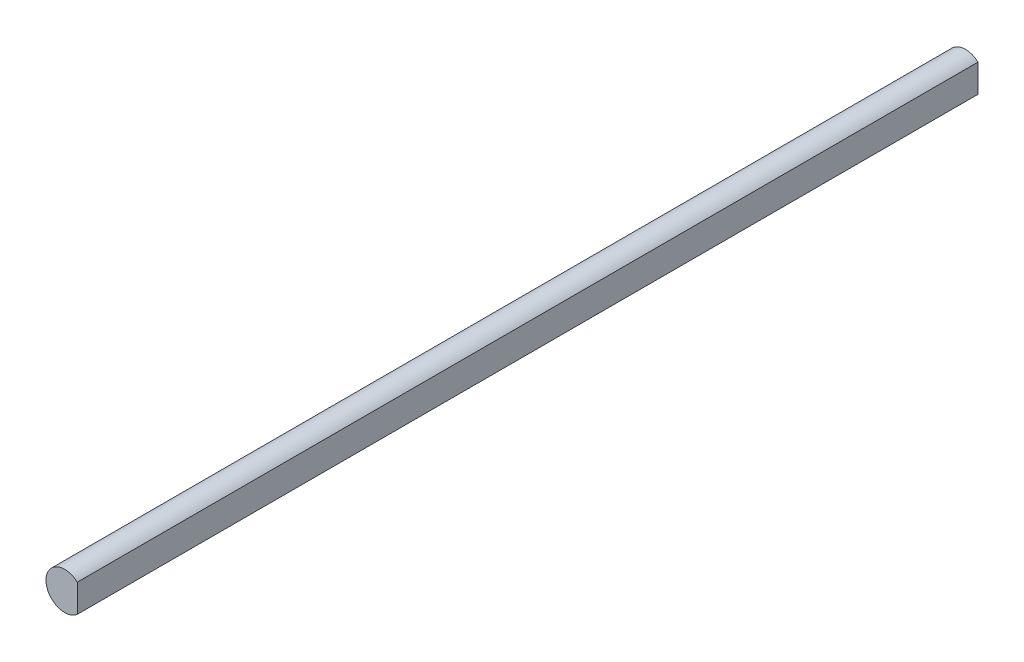
ISO-10303-21;
HEADER;
FILE_DESCRIPTION(('STEP AP214'),'2;1');
FILE_NAME('part.step','',(''),(''),'','','');
FILE_SCHEMA(('AUTOMOTIVE_DESIGN { 1 0 10303 214 1 1 1 1 }'));
ENDSEC;
DATA;
#1=APPLICATION_CONTEXT('core data for automotive mechanical design processes');
#2=APPLICATION_PROTOCOL_DEFINITION('international standard','automotive_design',2000,#1);
#3=PRODUCT_CONTEXT('',#1,'mechanical');
#4=PRODUCT('Part','Part','',(#3));
#5=PRODUCT_RELATED_PRODUCT_CATEGORY('part','',(#4));
#6=PRODUCT_DEFINITION_FORMATION('','',#4);
#7=PRODUCT_DEFINITION_CONTEXT('part definition',#1,'design');
#8=PRODUCT_DEFINITION('design','',#6,#7);
#9=PRODUCT_DEFINITION_SHAPE('','',#8);
#10=(LENGTH_UNIT() NAMED_UNIT(*) SI_UNIT(.MILLI.,.METRE.));
#11=(NAMED_UNIT(*) PLANE_ANGLE_UNIT() SI_UNIT($,.RADIAN.));
#12=(NAMED_UNIT(*) SI_UNIT($,.STERADIAN.) SOLID_ANGLE_UNIT());
#13=UNCERTAINTY_MEASURE_WITH_UNIT(LENGTH_MEASURE(1.E-05),#10,'distance_accuracy_value','');
#14=(GEOMETRIC_REPRESENTATION_CONTEXT(3) GLOBAL_UNCERTAINTY_ASSIGNED_CONTEXT((#13)) GLOBAL_UNIT_ASSIGNED_CONTEXT((#10,
#11,#12)) REPRESENTATION_CONTEXT('',''));
#15=CARTESIAN_POINT('',(0.,0.,0.));
#16=DIRECTION('',(0.,0.,1.));
#17=DIRECTION('',(1.,0.,0.));
#18=AXIS2_PLACEMENT_3D('',#15,#16,#17);
#19=CARTESIAN_POINT('',(0.,0.,120.));
#20=DIRECTION('',(0.,0.,-1.));
#21=DIRECTION('',(-1.,0.,0.));
#22=AXIS2_PLACEMENT_3D('',#19,#20,#21);
#23=CYLINDRICAL_SURFACE('',#22,2.5);
#24=CARTESIAN_POINT('',(0.,0.,120.));
#25=DIRECTION('',(0.,0.,1.));
#26=DIRECTION('',(1.,0.,0.));
#27=AXIS2_PLACEMENT_3D('',#24,#25,#26);
#28=CIRCLE('',#27,2.5);
#29=CARTESIAN_POINT('',(1.67291040295499,1.85778652801795,120.));
#30=VERTEX_POINT('',#29);
#31=CARTESIAN_POINT('',(1.67291040295499,-1.85778652801795,120.));
#32=VERTEX_POINT('',#31);
#33=EDGE_CURVE('E11',#30,#32,#28,.T.);
#34=ORIENTED_EDGE('',*,*,#33,.F.);
#35=DIRECTION('',(0.,0.,-1.));
#36=VECTOR('',#35,1.);
#37=CARTESIAN_POINT('',(1.67291040295499,1.85778652801795,120.));
#38=LINE('',#37,#36);
#39=CARTESIAN_POINT('',(1.67291040295499,1.85778652801795,0.));
#40=VERTEX_POINT('',#39);
#41=EDGE_CURVE('E66',#30,#40,#38,.T.);
#42=ORIENTED_EDGE('',*,*,#41,.T.);
#43=CARTESIAN_POINT('',(0.,0.,0.));
#44=DIRECTION('',(0.,0.,1.));
#45=DIRECTION('',(1.,0.,0.));
#46=AXIS2_PLACEMENT_3D('',#43,#44,#45);
#47=CIRCLE('',#46,2.5);
#48=CARTESIAN_POINT('',(1.67291040295499,-1.85778652801795,0.));
#49=VERTEX_POINT('',#48);
#50=EDGE_CURVE('E48',#40,#49,#47,.T.);
#51=ORIENTED_EDGE('',*,*,#50,.T.);
#52=DIRECTION('',(0.,0.,-1.));
#53=VECTOR('',#52,1.);
#54=CARTESIAN_POINT('',(1.67291040295499,-1.85778652801795,120.));
#55=LINE('',#54,#53);
#56=EDGE_CURVE('E60',#32,#49,#55,.T.);
#57=ORIENTED_EDGE('',*,*,#56,.F.);
#58=EDGE_LOOP('',(#34,#42,#51,#57));
#59=FACE_BOUND('',#58,.T.);
#60=ADVANCED_FACE('F45',(#59),#23,.T.);
#61=CARTESIAN_POINT('',(0.,0.,120.));
#62=DIRECTION('',(0.,0.,1.));
#63=DIRECTION('',(1.,0.,0.));
#64=AXIS2_PLACEMENT_3D('',#61,#62,#63);
#65=PLANE('',#64);
#66=DIRECTION('',(0.,1.,0.));
#67=VECTOR('',#66,1.);
#68=CARTESIAN_POINT('',(1.67291040295499,1.85778652801795,120.));
#69=LINE('',#68,#67);
#70=EDGE_CURVE('E76',#32,#30,#69,.T.);
#71=ORIENTED_EDGE('',*,*,#70,.T.);
#72=ORIENTED_EDGE('',*,*,#33,.T.);
#73=EDGE_LOOP('',(#71,#72));
#74=FACE_BOUND('',#73,.T.);
#75=ADVANCED_FACE('F89',(#74),#65,.T.);
#76=CARTESIAN_POINT('',(0.,0.,0.));
#77=DIRECTION('',(0.,0.,1.));
#78=DIRECTION('',(1.,0.,0.));
#79=AXIS2_PLACEMENT_3D('',#76,#77,#78);
#80=PLANE('',#79);
#81=ORIENTED_EDGE('',*,*,#50,.F.);
#82=DIRECTION('',(0.,1.,0.));
#83=VECTOR('',#82,1.);
#84=CARTESIAN_POINT('',(1.67291040295499,1.85778652801795,0.));
#85=LINE('',#84,#83);
#86=EDGE_CURVE('E70',#49,#40,#85,.T.);
#87=ORIENTED_EDGE('',*,*,#86,.F.);
#88=EDGE_LOOP('',(#81,#87));
#89=FACE_BOUND('',#88,.T.);
#90=ADVANCED_FACE('F82',(#89),#80,.F.);
#91=CARTESIAN_POINT('',(1.67291040295499,1.85778652801795,120.));
#92=DIRECTION('',(-1.,0.,0.));
#93=DIRECTION('',(0.,0.,1.));
#94=AXIS2_PLACEMENT_3D('',#91,#92,#93);
#95=PLANE('',#94);
#96=ORIENTED_EDGE('',*,*,#86,.T.);
#97=ORIENTED_EDGE('',*,*,#41,.F.);
#98=ORIENTED_EDGE('',*,*,#70,.F.);
#99=ORIENTED_EDGE('',*,*,#56,.T.);
#100=EDGE_LOOP('',(#96,#97,#98,#99));
#101=FACE_BOUND('',#100,.T.);
#102=ADVANCED_FACE('F71',(#101),#95,.F.);
#103=CLOSED_SHELL('',(#60,#75,#90,#102));
#104=MANIFOLD_SOLID_BREP('B2',#103);
#105=ADVANCED_BREP_SHAPE_REPRESENTATION('',(#18,#104),#14);
#106=SHAPE_DEFINITION_REPRESENTATION(#9,#105);
ENDSEC;
END-ISO-10303-21;
